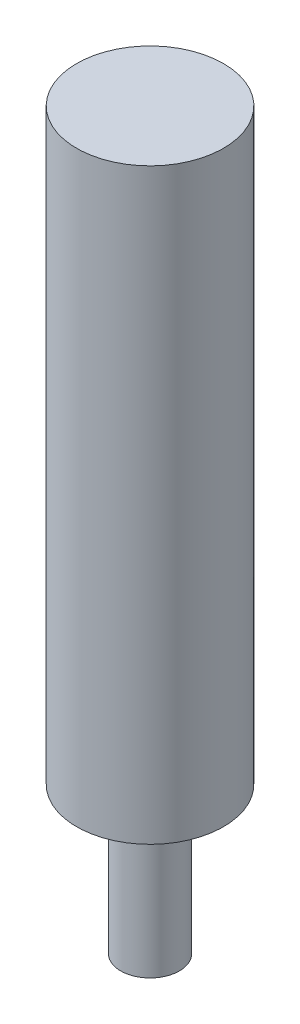
ISO-10303-21;
HEADER;
FILE_DESCRIPTION(('STEP AP214'),'2;1');
FILE_NAME('part.step','',(''),(''),'','','');
FILE_SCHEMA(('AUTOMOTIVE_DESIGN { 1 0 10303 214 1 1 1 1 }'));
ENDSEC;
DATA;
#1=APPLICATION_CONTEXT('core data for automotive mechanical design processes');
#2=APPLICATION_PROTOCOL_DEFINITION('international standard','automotive_design',2000,#1);
#3=PRODUCT_CONTEXT('',#1,'mechanical');
#4=PRODUCT('Part','Part','',(#3));
#5=PRODUCT_RELATED_PRODUCT_CATEGORY('part','',(#4));
#6=PRODUCT_DEFINITION_FORMATION('','',#4);
#7=PRODUCT_DEFINITION_CONTEXT('part definition',#1,'design');
#8=PRODUCT_DEFINITION('design','',#6,#7);
#9=PRODUCT_DEFINITION_SHAPE('','',#8);
#10=(LENGTH_UNIT() NAMED_UNIT(*) SI_UNIT(.MILLI.,.METRE.));
#11=(NAMED_UNIT(*) PLANE_ANGLE_UNIT() SI_UNIT($,.RADIAN.));
#12=(NAMED_UNIT(*) SI_UNIT($,.STERADIAN.) SOLID_ANGLE_UNIT());
#13=UNCERTAINTY_MEASURE_WITH_UNIT(LENGTH_MEASURE(1.E-05),#10,'distance_accuracy_value','');
#14=(GEOMETRIC_REPRESENTATION_CONTEXT(3) GLOBAL_UNCERTAINTY_ASSIGNED_CONTEXT((#13)) GLOBAL_UNIT_ASSIGNED_CONTEXT((#10,
#11,#12)) REPRESENTATION_CONTEXT('',''));
#15=CARTESIAN_POINT('',(0.,0.,0.));
#16=DIRECTION('',(0.,0.,1.));
#17=DIRECTION('',(1.,0.,0.));
#18=AXIS2_PLACEMENT_3D('',#15,#16,#17);
#19=CARTESIAN_POINT('',(0.,0.,0.));
#20=DIRECTION('',(0.,1.,0.));
#21=DIRECTION('',(0.,0.,1.));
#22=AXIS2_PLACEMENT_3D('',#19,#20,#21);
#23=PLANE('',#22);
#24=CARTESIAN_POINT('',(0.,0.,0.));
#25=DIRECTION('',(0.,-1.,0.));
#26=DIRECTION('',(0.,0.,-1.));
#27=AXIS2_PLACEMENT_3D('',#24,#25,#26);
#28=CIRCLE('',#27,5.);
#29=CARTESIAN_POINT('',(0.,0.,-5.));
#30=VERTEX_POINT('',#29);
#31=EDGE_CURVE('E10',#30,#30,#28,.T.);
#32=ORIENTED_EDGE('',*,*,#31,.F.);
#33=EDGE_LOOP('',(#32));
#34=FACE_BOUND('',#33,.T.);
#35=ADVANCED_FACE('F31',(#34),#23,.T.);
#36=CARTESIAN_POINT('',(0.,-54.,0.));
#37=DIRECTION('',(0.,-1.,0.));
#38=DIRECTION('',(0.,0.,-1.));
#39=AXIS2_PLACEMENT_3D('',#36,#37,#38);
#40=CYLINDRICAL_SURFACE('',#39,5.);
#41=ORIENTED_EDGE('',*,*,#31,.T.);
#42=EDGE_LOOP('',(#41));
#43=FACE_BOUND('',#42,.T.);
#44=CARTESIAN_POINT('',(0.,-40.,0.));
#45=DIRECTION('',(0.,-1.,0.));
#46=DIRECTION('',(0.,0.,-1.));
#47=AXIS2_PLACEMENT_3D('',#44,#45,#46);
#48=CIRCLE('',#47,5.);
#49=CARTESIAN_POINT('',(0.,-40.,-5.));
#50=VERTEX_POINT('',#49);
#51=EDGE_CURVE('E37',#50,#50,#48,.T.);
#52=ORIENTED_EDGE('',*,*,#51,.F.);
#53=EDGE_LOOP('',(#52));
#54=FACE_BOUND('',#53,.T.);
#55=ADVANCED_FACE('F63',(#43,#54),#40,.T.);
#56=CARTESIAN_POINT('',(5.,-40.,0.));
#57=DIRECTION('',(0.,-1.,0.));
#58=DIRECTION('',(0.,0.,-1.));
#59=AXIS2_PLACEMENT_3D('',#56,#57,#58);
#60=PLANE('',#59);
#61=ORIENTED_EDGE('',*,*,#51,.T.);
#62=EDGE_LOOP('',(#61));
#63=FACE_BOUND('',#62,.T.);
#64=CARTESIAN_POINT('',(0.,-40.,0.));
#65=DIRECTION('',(0.,-1.,0.));
#66=DIRECTION('',(0.,0.,-1.));
#67=AXIS2_PLACEMENT_3D('',#64,#65,#66);
#68=CIRCLE('',#67,2.);
#69=CARTESIAN_POINT('',(0.,-40.,-2.));
#70=VERTEX_POINT('',#69);
#71=EDGE_CURVE('E41',#70,#70,#68,.T.);
#72=ORIENTED_EDGE('',*,*,#71,.F.);
#73=EDGE_LOOP('',(#72));
#74=FACE_BOUND('',#73,.T.);
#75=ADVANCED_FACE('F55',(#63,#74),#60,.T.);
#76=CARTESIAN_POINT('',(0.,-54.,0.));
#77=DIRECTION('',(0.,-1.,0.));
#78=DIRECTION('',(0.,0.,-1.));
#79=AXIS2_PLACEMENT_3D('',#76,#77,#78);
#80=CYLINDRICAL_SURFACE('',#79,2.);
#81=ORIENTED_EDGE('',*,*,#71,.T.);
#82=EDGE_LOOP('',(#81));
#83=FACE_BOUND('',#82,.T.);
#84=CARTESIAN_POINT('',(0.,-50.,0.));
#85=DIRECTION('',(0.,-1.,0.));
#86=DIRECTION('',(0.,0.,-1.));
#87=AXIS2_PLACEMENT_3D('',#84,#85,#86);
#88=CIRCLE('',#87,2.);
#89=CARTESIAN_POINT('',(0.,-50.,-2.));
#90=VERTEX_POINT('',#89);
#91=EDGE_CURVE('E45',#90,#90,#88,.T.);
#92=ORIENTED_EDGE('',*,*,#91,.F.);
#93=EDGE_LOOP('',(#92));
#94=FACE_BOUND('',#93,.T.);
#95=ADVANCED_FACE('F53',(#83,#94),#80,.T.);
#96=CARTESIAN_POINT('',(2.,-50.,0.));
#97=DIRECTION('',(0.,-1.,0.));
#98=DIRECTION('',(0.,0.,-1.));
#99=AXIS2_PLACEMENT_3D('',#96,#97,#98);
#100=PLANE('',#99);
#101=ORIENTED_EDGE('',*,*,#91,.T.);
#102=EDGE_LOOP('',(#101));
#103=FACE_BOUND('',#102,.T.);
#104=ADVANCED_FACE('F51',(#103),#100,.T.);
#105=CLOSED_SHELL('',(#35,#55,#75,#95,#104));
#106=MANIFOLD_SOLID_BREP('B2',#105);
#107=ADVANCED_BREP_SHAPE_REPRESENTATION('',(#18,#106),#14);
#108=SHAPE_DEFINITION_REPRESENTATION(#9,#107);
ENDSEC;
END-ISO-10303-21;
